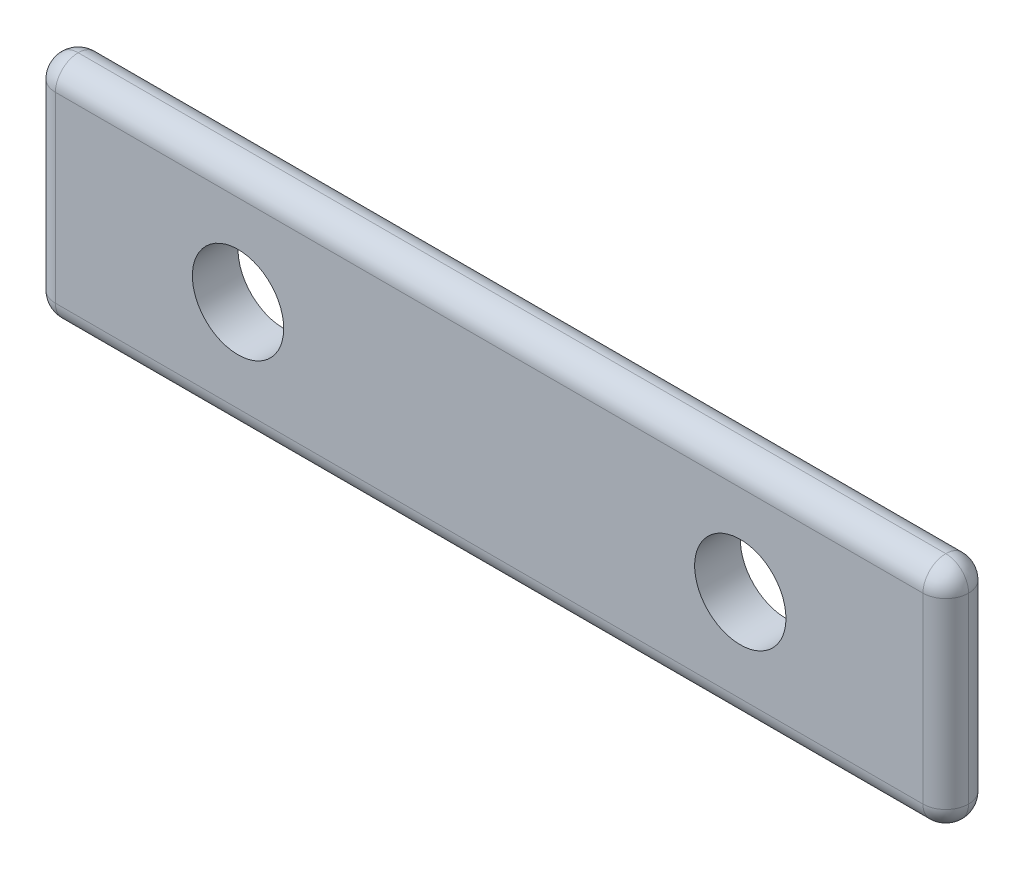
ISO-10303-21;
HEADER;
FILE_DESCRIPTION(('STEP AP214'),'2;1');
FILE_NAME('part.step','',(''),(''),'','','');
FILE_SCHEMA(('AUTOMOTIVE_DESIGN { 1 0 10303 214 1 1 1 1 }'));
ENDSEC;
DATA;
#1=APPLICATION_CONTEXT('core data for automotive mechanical design processes');
#2=APPLICATION_PROTOCOL_DEFINITION('international standard','automotive_design',2000,#1);
#3=PRODUCT_CONTEXT('',#1,'mechanical');
#4=PRODUCT('Part','Part','',(#3));
#5=PRODUCT_RELATED_PRODUCT_CATEGORY('part','',(#4));
#6=PRODUCT_DEFINITION_FORMATION('','',#4);
#7=PRODUCT_DEFINITION_CONTEXT('part definition',#1,'design');
#8=PRODUCT_DEFINITION('design','',#6,#7);
#9=PRODUCT_DEFINITION_SHAPE('','',#8);
#10=(LENGTH_UNIT() NAMED_UNIT(*) SI_UNIT(.MILLI.,.METRE.));
#11=(NAMED_UNIT(*) PLANE_ANGLE_UNIT() SI_UNIT($,.RADIAN.));
#12=(NAMED_UNIT(*) SI_UNIT($,.STERADIAN.) SOLID_ANGLE_UNIT());
#13=UNCERTAINTY_MEASURE_WITH_UNIT(LENGTH_MEASURE(1.E-05),#10,'distance_accuracy_value','');
#14=(GEOMETRIC_REPRESENTATION_CONTEXT(3) GLOBAL_UNCERTAINTY_ASSIGNED_CONTEXT((#13)) GLOBAL_UNIT_ASSIGNED_CONTEXT((#10,
#11,#12)) REPRESENTATION_CONTEXT('',''));
#15=CARTESIAN_POINT('',(0.,0.,0.));
#16=DIRECTION('',(0.,0.,1.));
#17=DIRECTION('',(1.,0.,0.));
#18=AXIS2_PLACEMENT_3D('',#15,#16,#17);
#19=CARTESIAN_POINT('',(0.,0.,10.));
#20=DIRECTION('',(0.,0.,-1.));
#21=DIRECTION('',(-1.,0.,0.));
#22=AXIS2_PLACEMENT_3D('',#19,#20,#21);
#23=PLANE('',#22);
#24=CARTESIAN_POINT('',(45.,25.2068655717166,10.));
#25=DIRECTION('',(0.,0.,1.));
#26=DIRECTION('',(1.,0.,0.));
#27=AXIS2_PLACEMENT_3D('',#24,#25,#26);
#28=CIRCLE('',#27,10.);
#29=CARTESIAN_POINT('',(55.,25.2068655717166,10.));
#30=VERTEX_POINT('',#29);
#31=EDGE_CURVE('E434',#30,#30,#28,.T.);
#32=ORIENTED_EDGE('',*,*,#31,.F.);
#33=EDGE_LOOP('',(#32));
#34=FACE_BOUND('',#33,.T.);
#35=CARTESIAN_POINT('',(155.,25.2068655717166,10.));
#36=DIRECTION('',(0.,0.,1.));
#37=DIRECTION('',(1.,0.,0.));
#38=AXIS2_PLACEMENT_3D('',#35,#36,#37);
#39=CIRCLE('',#38,10.);
#40=CARTESIAN_POINT('',(165.,25.2068655717166,10.));
#41=VERTEX_POINT('',#40);
#42=EDGE_CURVE('E438',#41,#41,#39,.T.);
#43=ORIENTED_EDGE('',*,*,#42,.F.);
#44=EDGE_LOOP('',(#43));
#45=FACE_BOUND('',#44,.T.);
#46=DIRECTION('',(0.,-1.,0.));
#47=VECTOR('',#46,1.);
#48=CARTESIAN_POINT('',(5.,0.,10.));
#49=LINE('',#48,#47);
#50=CARTESIAN_POINT('',(5.,45.,10.));
#51=VERTEX_POINT('',#50);
#52=CARTESIAN_POINT('',(5.,5.,10.));
#53=VERTEX_POINT('',#52);
#54=EDGE_CURVE('E116',#51,#53,#49,.T.);
#55=ORIENTED_EDGE('',*,*,#54,.T.);
#56=DIRECTION('',(1.,0.,0.));
#57=VECTOR('',#56,1.);
#58=CARTESIAN_POINT('',(0.,5.,10.));
#59=LINE('',#58,#57);
#60=CARTESIAN_POINT('',(195.,5.,10.));
#61=VERTEX_POINT('',#60);
#62=EDGE_CURVE('E11',#53,#61,#59,.T.);
#63=ORIENTED_EDGE('',*,*,#62,.T.);
#64=DIRECTION('',(0.,1.,0.));
#65=VECTOR('',#64,1.);
#66=CARTESIAN_POINT('',(195.,0.,10.));
#67=LINE('',#66,#65);
#68=CARTESIAN_POINT('',(195.,45.,10.));
#69=VERTEX_POINT('',#68);
#70=EDGE_CURVE('E50',#61,#69,#67,.T.);
#71=ORIENTED_EDGE('',*,*,#70,.T.);
#72=DIRECTION('',(-1.,0.,0.));
#73=VECTOR('',#72,1.);
#74=CARTESIAN_POINT('',(0.,45.,10.));
#75=LINE('',#74,#73);
#76=EDGE_CURVE('E115',#69,#51,#75,.T.);
#77=ORIENTED_EDGE('',*,*,#76,.T.);
#78=EDGE_LOOP('',(#55,#63,#71,#77));
#79=FACE_BOUND('',#78,.T.);
#80=ADVANCED_FACE('F39',(#34,#45,#79),#23,.F.);
#81=CARTESIAN_POINT('',(0.,0.,0.));
#82=DIRECTION('',(0.,0.,-1.));
#83=DIRECTION('',(-1.,0.,0.));
#84=AXIS2_PLACEMENT_3D('',#81,#82,#83);
#85=PLANE('',#84);
#86=CARTESIAN_POINT('',(45.,25.2068655717166,0.));
#87=DIRECTION('',(0.,0.,1.));
#88=DIRECTION('',(1.,0.,0.));
#89=AXIS2_PLACEMENT_3D('',#86,#87,#88);
#90=CIRCLE('',#89,9.99999999999999);
#91=CARTESIAN_POINT('',(55.,25.2068655717166,0.));
#92=VERTEX_POINT('',#91);
#93=EDGE_CURVE('E432',#92,#92,#90,.T.);
#94=ORIENTED_EDGE('',*,*,#93,.T.);
#95=EDGE_LOOP('',(#94));
#96=FACE_BOUND('',#95,.T.);
#97=CARTESIAN_POINT('',(155.,25.2068655717166,0.));
#98=DIRECTION('',(0.,0.,1.));
#99=DIRECTION('',(1.,0.,0.));
#100=AXIS2_PLACEMENT_3D('',#97,#98,#99);
#101=CIRCLE('',#100,10.);
#102=CARTESIAN_POINT('',(165.,25.2068655717166,0.));
#103=VERTEX_POINT('',#102);
#104=EDGE_CURVE('E181',#103,#103,#101,.T.);
#105=ORIENTED_EDGE('',*,*,#104,.T.);
#106=EDGE_LOOP('',(#105));
#107=FACE_BOUND('',#106,.T.);
#108=DIRECTION('',(0.,1.,0.));
#109=VECTOR('',#108,1.);
#110=CARTESIAN_POINT('',(195.,0.,0.));
#111=LINE('',#110,#109);
#112=CARTESIAN_POINT('',(195.,45.,0.));
#113=VERTEX_POINT('',#112);
#114=CARTESIAN_POINT('',(195.,5.,0.));
#115=VERTEX_POINT('',#114);
#116=EDGE_CURVE('E178',#113,#115,#111,.F.);
#117=ORIENTED_EDGE('',*,*,#116,.T.);
#118=DIRECTION('',(1.,0.,0.));
#119=VECTOR('',#118,1.);
#120=CARTESIAN_POINT('',(0.,5.,0.));
#121=LINE('',#120,#119);
#122=CARTESIAN_POINT('',(5.,5.,0.));
#123=VERTEX_POINT('',#122);
#124=EDGE_CURVE('E122',#115,#123,#121,.F.);
#125=ORIENTED_EDGE('',*,*,#124,.T.);
#126=DIRECTION('',(0.,-1.,0.));
#127=VECTOR('',#126,1.);
#128=CARTESIAN_POINT('',(5.,50.,0.));
#129=LINE('',#128,#127);
#130=CARTESIAN_POINT('',(5.,45.,0.));
#131=VERTEX_POINT('',#130);
#132=EDGE_CURVE('E102',#123,#131,#129,.F.);
#133=ORIENTED_EDGE('',*,*,#132,.T.);
#134=DIRECTION('',(-1.,0.,0.));
#135=VECTOR('',#134,1.);
#136=CARTESIAN_POINT('',(200.,45.,0.));
#137=LINE('',#136,#135);
#138=EDGE_CURVE('E172',#131,#113,#137,.F.);
#139=ORIENTED_EDGE('',*,*,#138,.T.);
#140=EDGE_LOOP('',(#117,#125,#133,#139));
#141=FACE_BOUND('',#140,.T.);
#142=ADVANCED_FACE('F257',(#96,#107,#141),#85,.T.);
#143=CARTESIAN_POINT('',(5.,0.,5.));
#144=DIRECTION('',(0.,-1.,0.));
#145=DIRECTION('',(0.,0.,-1.));
#146=AXIS2_PLACEMENT_3D('',#143,#144,#145);
#147=CYLINDRICAL_SURFACE('',#146,5.);
#148=DIRECTION('',(0.,-1.,0.));
#149=VECTOR('',#148,1.);
#150=CARTESIAN_POINT('',(0.,0.,5.));
#151=LINE('',#150,#149);
#152=CARTESIAN_POINT('',(0.,5.,5.));
#153=VERTEX_POINT('',#152);
#154=CARTESIAN_POINT('',(0.,45.,5.));
#155=VERTEX_POINT('',#154);
#156=EDGE_CURVE('E158',#153,#155,#151,.F.);
#157=ORIENTED_EDGE('',*,*,#156,.F.);
#158=CARTESIAN_POINT('',(5.,5.,5.));
#159=DIRECTION('',(0.,-1.,0.));
#160=DIRECTION('',(0.,0.,-1.));
#161=AXIS2_PLACEMENT_3D('',#158,#159,#160);
#162=CIRCLE('',#161,5.);
#163=EDGE_CURVE('E43',#53,#153,#162,.T.);
#164=ORIENTED_EDGE('',*,*,#163,.F.);
#165=ORIENTED_EDGE('',*,*,#54,.F.);
#166=CARTESIAN_POINT('',(5.,45.,5.));
#167=DIRECTION('',(0.,1.,0.));
#168=DIRECTION('',(0.,0.,1.));
#169=AXIS2_PLACEMENT_3D('',#166,#167,#168);
#170=CIRCLE('',#169,5.);
#171=EDGE_CURVE('E86',#155,#51,#170,.T.);
#172=ORIENTED_EDGE('',*,*,#171,.F.);
#173=EDGE_LOOP('',(#157,#164,#165,#172));
#174=FACE_BOUND('',#173,.T.);
#175=ADVANCED_FACE('F41',(#174),#147,.T.);
#176=CARTESIAN_POINT('',(5.,5.,5.));
#177=DIRECTION('',(-1.,0.,0.));
#178=DIRECTION('',(0.,0.,1.));
#179=AXIS2_PLACEMENT_3D('',#176,#177,#178);
#180=SPHERICAL_SURFACE('',#179,5.);
#181=ORIENTED_EDGE('',*,*,#163,.T.);
#182=CARTESIAN_POINT('',(5.,5.,5.));
#183=DIRECTION('',(0.,0.,-1.));
#184=DIRECTION('',(-1.,0.,0.));
#185=AXIS2_PLACEMENT_3D('',#182,#183,#184);
#186=CIRCLE('',#185,5.);
#187=CARTESIAN_POINT('',(5.,0.,5.));
#188=VERTEX_POINT('',#187);
#189=EDGE_CURVE('E93',#188,#153,#186,.T.);
#190=ORIENTED_EDGE('',*,*,#189,.F.);
#191=CARTESIAN_POINT('',(5.,5.,5.));
#192=DIRECTION('',(-1.,0.,0.));
#193=DIRECTION('',(0.,0.,1.));
#194=AXIS2_PLACEMENT_3D('',#191,#192,#193);
#195=CIRCLE('',#194,5.);
#196=EDGE_CURVE('E141',#53,#188,#195,.F.);
#197=ORIENTED_EDGE('',*,*,#196,.F.);
#198=EDGE_LOOP('',(#181,#190,#197));
#199=FACE_BOUND('',#198,.T.);
#200=ADVANCED_FACE('F170',(#199),#180,.T.);
#201=CARTESIAN_POINT('',(5.,45.,5.));
#202=DIRECTION('',(-1.,0.,0.));
#203=DIRECTION('',(0.,0.,1.));
#204=AXIS2_PLACEMENT_3D('',#201,#202,#203);
#205=SPHERICAL_SURFACE('',#204,5.);
#206=CARTESIAN_POINT('',(5.,45.,5.));
#207=DIRECTION('',(0.,0.,1.));
#208=DIRECTION('',(1.,0.,0.));
#209=AXIS2_PLACEMENT_3D('',#206,#207,#208);
#210=CIRCLE('',#209,5.);
#211=CARTESIAN_POINT('',(5.,50.,5.));
#212=VERTEX_POINT('',#211);
#213=EDGE_CURVE('E132',#155,#212,#210,.F.);
#214=ORIENTED_EDGE('',*,*,#213,.F.);
#215=ORIENTED_EDGE('',*,*,#171,.T.);
#216=CARTESIAN_POINT('',(5.,45.,5.));
#217=DIRECTION('',(-1.,0.,0.));
#218=DIRECTION('',(0.,0.,1.));
#219=AXIS2_PLACEMENT_3D('',#216,#217,#218);
#220=CIRCLE('',#219,5.);
#221=EDGE_CURVE('E130',#212,#51,#220,.F.);
#222=ORIENTED_EDGE('',*,*,#221,.F.);
#223=EDGE_LOOP('',(#214,#215,#222));
#224=FACE_BOUND('',#223,.T.);
#225=ADVANCED_FACE('F129',(#224),#205,.T.);
#226=CARTESIAN_POINT('',(5.,0.,5.));
#227=DIRECTION('',(0.,1.,0.));
#228=DIRECTION('',(0.,0.,1.));
#229=AXIS2_PLACEMENT_3D('',#226,#227,#228);
#230=CYLINDRICAL_SURFACE('',#229,5.);
#231=CARTESIAN_POINT('',(5.,5.,5.));
#232=DIRECTION('',(0.,-1.,0.));
#233=DIRECTION('',(0.,0.,-1.));
#234=AXIS2_PLACEMENT_3D('',#231,#232,#233);
#235=CIRCLE('',#234,5.);
#236=EDGE_CURVE('E155',#153,#123,#235,.T.);
#237=ORIENTED_EDGE('',*,*,#236,.F.);
#238=ORIENTED_EDGE('',*,*,#156,.T.);
#239=CARTESIAN_POINT('',(5.,45.,5.));
#240=DIRECTION('',(0.,1.,0.));
#241=DIRECTION('',(0.,0.,1.));
#242=AXIS2_PLACEMENT_3D('',#239,#240,#241);
#243=CIRCLE('',#242,5.);
#244=EDGE_CURVE('E142',#131,#155,#243,.T.);
#245=ORIENTED_EDGE('',*,*,#244,.F.);
#246=ORIENTED_EDGE('',*,*,#132,.F.);
#247=EDGE_LOOP('',(#237,#238,#245,#246));
#248=FACE_BOUND('',#247,.T.);
#249=ADVANCED_FACE('F168',(#248),#230,.T.);
#250=CARTESIAN_POINT('',(5.,5.,5.));
#251=DIRECTION('',(-1.,0.,0.));
#252=DIRECTION('',(0.,0.,1.));
#253=AXIS2_PLACEMENT_3D('',#250,#251,#252);
#254=SPHERICAL_SURFACE('',#253,5.);
#255=ORIENTED_EDGE('',*,*,#189,.T.);
#256=ORIENTED_EDGE('',*,*,#236,.T.);
#257=CARTESIAN_POINT('',(5.,5.,5.));
#258=DIRECTION('',(-1.,0.,0.));
#259=DIRECTION('',(0.,-1.,0.));
#260=AXIS2_PLACEMENT_3D('',#257,#258,#259);
#261=CIRCLE('',#260,5.);
#262=EDGE_CURVE('E149',#188,#123,#261,.F.);
#263=ORIENTED_EDGE('',*,*,#262,.F.);
#264=EDGE_LOOP('',(#255,#256,#263));
#265=FACE_BOUND('',#264,.T.);
#266=ADVANCED_FACE('F245',(#265),#254,.T.);
#267=CARTESIAN_POINT('',(0.,5.,5.));
#268=DIRECTION('',(1.,0.,0.));
#269=DIRECTION('',(0.,0.,-1.));
#270=AXIS2_PLACEMENT_3D('',#267,#268,#269);
#271=CYLINDRICAL_SURFACE('',#270,5.);
#272=ORIENTED_EDGE('',*,*,#62,.F.);
#273=ORIENTED_EDGE('',*,*,#196,.T.);
#274=DIRECTION('',(1.,0.,0.));
#275=VECTOR('',#274,1.);
#276=CARTESIAN_POINT('',(200.,0.,5.));
#277=LINE('',#276,#275);
#278=CARTESIAN_POINT('',(195.,0.,5.));
#279=VERTEX_POINT('',#278);
#280=EDGE_CURVE('E236',#279,#188,#277,.F.);
#281=ORIENTED_EDGE('',*,*,#280,.F.);
#282=CARTESIAN_POINT('',(195.,5.,5.));
#283=DIRECTION('',(1.,0.,0.));
#284=DIRECTION('',(0.,0.,-1.));
#285=AXIS2_PLACEMENT_3D('',#282,#283,#284);
#286=CIRCLE('',#285,5.);
#287=EDGE_CURVE('E232',#61,#279,#286,.T.);
#288=ORIENTED_EDGE('',*,*,#287,.F.);
#289=EDGE_LOOP('',(#272,#273,#281,#288));
#290=FACE_BOUND('',#289,.T.);
#291=ADVANCED_FACE('F247',(#290),#271,.T.);
#292=CARTESIAN_POINT('',(0.,45.,5.));
#293=DIRECTION('',(-1.,0.,0.));
#294=DIRECTION('',(0.,0.,1.));
#295=AXIS2_PLACEMENT_3D('',#292,#293,#294);
#296=CYLINDRICAL_SURFACE('',#295,5.);
#297=ORIENTED_EDGE('',*,*,#221,.T.);
#298=ORIENTED_EDGE('',*,*,#76,.F.);
#299=CARTESIAN_POINT('',(195.,45.,5.));
#300=DIRECTION('',(1.,0.,0.));
#301=DIRECTION('',(0.,0.,-1.));
#302=AXIS2_PLACEMENT_3D('',#299,#300,#301);
#303=CIRCLE('',#302,5.);
#304=CARTESIAN_POINT('',(195.,50.,5.));
#305=VERTEX_POINT('',#304);
#306=EDGE_CURVE('E228',#305,#69,#303,.T.);
#307=ORIENTED_EDGE('',*,*,#306,.F.);
#308=DIRECTION('',(-1.,0.,0.));
#309=VECTOR('',#308,1.);
#310=CARTESIAN_POINT('',(0.,50.,5.));
#311=LINE('',#310,#309);
#312=EDGE_CURVE('E138',#212,#305,#311,.F.);
#313=ORIENTED_EDGE('',*,*,#312,.F.);
#314=EDGE_LOOP('',(#297,#298,#307,#313));
#315=FACE_BOUND('',#314,.T.);
#316=ADVANCED_FACE('F136',(#315),#296,.T.);
#317=CARTESIAN_POINT('',(5.,45.,5.));
#318=DIRECTION('',(-1.,0.,0.));
#319=DIRECTION('',(0.,0.,1.));
#320=AXIS2_PLACEMENT_3D('',#317,#318,#319);
#321=SPHERICAL_SURFACE('',#320,5.);
#322=ORIENTED_EDGE('',*,*,#244,.T.);
#323=ORIENTED_EDGE('',*,*,#213,.T.);
#324=CARTESIAN_POINT('',(5.,45.,5.));
#325=DIRECTION('',(-1.,0.,0.));
#326=DIRECTION('',(0.,0.,1.));
#327=AXIS2_PLACEMENT_3D('',#324,#325,#326);
#328=CIRCLE('',#327,5.);
#329=EDGE_CURVE('E165',#131,#212,#328,.F.);
#330=ORIENTED_EDGE('',*,*,#329,.F.);
#331=EDGE_LOOP('',(#322,#323,#330));
#332=FACE_BOUND('',#331,.T.);
#333=ADVANCED_FACE('F164',(#332),#321,.T.);
#334=CARTESIAN_POINT('',(200.,5.,5.));
#335=DIRECTION('',(-1.,0.,0.));
#336=DIRECTION('',(0.,0.,1.));
#337=AXIS2_PLACEMENT_3D('',#334,#335,#336);
#338=CYLINDRICAL_SURFACE('',#337,5.);
#339=CARTESIAN_POINT('',(195.,5.,5.));
#340=DIRECTION('',(1.,0.,0.));
#341=DIRECTION('',(0.,0.,-1.));
#342=AXIS2_PLACEMENT_3D('',#339,#340,#341);
#343=CIRCLE('',#342,5.);
#344=EDGE_CURVE('E216',#279,#115,#343,.T.);
#345=ORIENTED_EDGE('',*,*,#344,.F.);
#346=ORIENTED_EDGE('',*,*,#280,.T.);
#347=ORIENTED_EDGE('',*,*,#262,.T.);
#348=ORIENTED_EDGE('',*,*,#124,.F.);
#349=EDGE_LOOP('',(#345,#346,#347,#348));
#350=FACE_BOUND('',#349,.T.);
#351=ADVANCED_FACE('F244',(#350),#338,.T.);
#352=CARTESIAN_POINT('',(195.,5.,5.));
#353=DIRECTION('',(0.,-1.,0.));
#354=DIRECTION('',(0.,0.,-1.));
#355=AXIS2_PLACEMENT_3D('',#352,#353,#354);
#356=SPHERICAL_SURFACE('',#355,5.);
#357=ORIENTED_EDGE('',*,*,#287,.T.);
#358=CARTESIAN_POINT('',(195.,5.,5.));
#359=DIRECTION('',(0.,0.,-1.));
#360=DIRECTION('',(-1.,0.,0.));
#361=AXIS2_PLACEMENT_3D('',#358,#359,#360);
#362=CIRCLE('',#361,5.);
#363=CARTESIAN_POINT('',(200.,5.,5.));
#364=VERTEX_POINT('',#363);
#365=EDGE_CURVE('E212',#364,#279,#362,.T.);
#366=ORIENTED_EDGE('',*,*,#365,.F.);
#367=CARTESIAN_POINT('',(195.,5.,5.));
#368=DIRECTION('',(0.,-1.,0.));
#369=DIRECTION('',(0.,0.,-1.));
#370=AXIS2_PLACEMENT_3D('',#367,#368,#369);
#371=CIRCLE('',#370,5.);
#372=EDGE_CURVE('E208',#61,#364,#371,.F.);
#373=ORIENTED_EDGE('',*,*,#372,.F.);
#374=EDGE_LOOP('',(#357,#366,#373));
#375=FACE_BOUND('',#374,.T.);
#376=ADVANCED_FACE('F294',(#375),#356,.T.);
#377=CARTESIAN_POINT('',(195.,45.,5.));
#378=DIRECTION('',(0.,1.,0.));
#379=DIRECTION('',(0.,0.,1.));
#380=AXIS2_PLACEMENT_3D('',#377,#378,#379);
#381=SPHERICAL_SURFACE('',#380,5.);
#382=CARTESIAN_POINT('',(195.,45.,5.));
#383=DIRECTION('',(0.,0.,1.));
#384=DIRECTION('',(1.,0.,0.));
#385=AXIS2_PLACEMENT_3D('',#382,#383,#384);
#386=CIRCLE('',#385,5.);
#387=CARTESIAN_POINT('',(200.,45.,5.));
#388=VERTEX_POINT('',#387);
#389=EDGE_CURVE('E224',#305,#388,#386,.F.);
#390=ORIENTED_EDGE('',*,*,#389,.F.);
#391=ORIENTED_EDGE('',*,*,#306,.T.);
#392=CARTESIAN_POINT('',(195.,45.,5.));
#393=DIRECTION('',(0.,1.,0.));
#394=DIRECTION('',(0.,0.,1.));
#395=AXIS2_PLACEMENT_3D('',#392,#393,#394);
#396=CIRCLE('',#395,5.);
#397=EDGE_CURVE('E205',#388,#69,#396,.F.);
#398=ORIENTED_EDGE('',*,*,#397,.F.);
#399=EDGE_LOOP('',(#390,#391,#398));
#400=FACE_BOUND('',#399,.T.);
#401=ADVANCED_FACE('F290',(#400),#381,.T.);
#402=CARTESIAN_POINT('',(0.,45.,5.));
#403=DIRECTION('',(1.,0.,0.));
#404=DIRECTION('',(0.,0.,-1.));
#405=AXIS2_PLACEMENT_3D('',#402,#403,#404);
#406=CYLINDRICAL_SURFACE('',#405,5.);
#407=ORIENTED_EDGE('',*,*,#329,.T.);
#408=ORIENTED_EDGE('',*,*,#312,.T.);
#409=CARTESIAN_POINT('',(195.,45.,5.));
#410=DIRECTION('',(1.,0.,0.));
#411=DIRECTION('',(0.,0.,-1.));
#412=AXIS2_PLACEMENT_3D('',#409,#410,#411);
#413=CIRCLE('',#412,5.);
#414=EDGE_CURVE('E201',#113,#305,#413,.T.);
#415=ORIENTED_EDGE('',*,*,#414,.F.);
#416=ORIENTED_EDGE('',*,*,#138,.F.);
#417=EDGE_LOOP('',(#407,#408,#415,#416));
#418=FACE_BOUND('',#417,.T.);
#419=ADVANCED_FACE('F286',(#418),#406,.T.);
#420=CARTESIAN_POINT('',(195.,5.,5.));
#421=DIRECTION('',(0.,-1.,0.));
#422=DIRECTION('',(0.,0.,-1.));
#423=AXIS2_PLACEMENT_3D('',#420,#421,#422);
#424=SPHERICAL_SURFACE('',#423,5.);
#425=ORIENTED_EDGE('',*,*,#365,.T.);
#426=ORIENTED_EDGE('',*,*,#344,.T.);
#427=CARTESIAN_POINT('',(195.,5.,5.));
#428=DIRECTION('',(0.,-1.,0.));
#429=DIRECTION('',(1.,0.,0.));
#430=AXIS2_PLACEMENT_3D('',#427,#428,#429);
#431=CIRCLE('',#430,5.);
#432=EDGE_CURVE('E198',#364,#115,#431,.F.);
#433=ORIENTED_EDGE('',*,*,#432,.F.);
#434=EDGE_LOOP('',(#425,#426,#433));
#435=FACE_BOUND('',#434,.T.);
#436=ADVANCED_FACE('F282',(#435),#424,.T.);
#437=CARTESIAN_POINT('',(195.,0.,5.));
#438=DIRECTION('',(0.,1.,0.));
#439=DIRECTION('',(0.,0.,1.));
#440=AXIS2_PLACEMENT_3D('',#437,#438,#439);
#441=CYLINDRICAL_SURFACE('',#440,5.);
#442=ORIENTED_EDGE('',*,*,#70,.F.);
#443=ORIENTED_EDGE('',*,*,#372,.T.);
#444=DIRECTION('',(0.,1.,0.));
#445=VECTOR('',#444,1.);
#446=CARTESIAN_POINT('',(200.,50.,5.));
#447=LINE('',#446,#445);
#448=EDGE_CURVE('E194',#388,#364,#447,.F.);
#449=ORIENTED_EDGE('',*,*,#448,.F.);
#450=ORIENTED_EDGE('',*,*,#397,.T.);
#451=EDGE_LOOP('',(#442,#443,#449,#450));
#452=FACE_BOUND('',#451,.T.);
#453=ADVANCED_FACE('F278',(#452),#441,.T.);
#454=CARTESIAN_POINT('',(195.,45.,5.));
#455=DIRECTION('',(0.,1.,0.));
#456=DIRECTION('',(0.,0.,1.));
#457=AXIS2_PLACEMENT_3D('',#454,#455,#456);
#458=SPHERICAL_SURFACE('',#457,5.);
#459=ORIENTED_EDGE('',*,*,#414,.T.);
#460=ORIENTED_EDGE('',*,*,#389,.T.);
#461=CARTESIAN_POINT('',(195.,45.,5.));
#462=DIRECTION('',(0.,1.,0.));
#463=DIRECTION('',(0.,0.,1.));
#464=AXIS2_PLACEMENT_3D('',#461,#462,#463);
#465=CIRCLE('',#464,5.);
#466=EDGE_CURVE('E190',#113,#388,#465,.F.);
#467=ORIENTED_EDGE('',*,*,#466,.F.);
#468=EDGE_LOOP('',(#459,#460,#467));
#469=FACE_BOUND('',#468,.T.);
#470=ADVANCED_FACE('F274',(#469),#458,.T.);
#471=CARTESIAN_POINT('',(195.,50.,5.));
#472=DIRECTION('',(0.,-1.,0.));
#473=DIRECTION('',(0.,0.,-1.));
#474=AXIS2_PLACEMENT_3D('',#471,#472,#473);
#475=CYLINDRICAL_SURFACE('',#474,5.);
#476=ORIENTED_EDGE('',*,*,#432,.T.);
#477=ORIENTED_EDGE('',*,*,#116,.F.);
#478=ORIENTED_EDGE('',*,*,#466,.T.);
#479=ORIENTED_EDGE('',*,*,#448,.T.);
#480=EDGE_LOOP('',(#476,#477,#478,#479));
#481=FACE_BOUND('',#480,.T.);
#482=ADVANCED_FACE('F271',(#481),#475,.T.);
#483=CARTESIAN_POINT('',(155.,25.2068655717166,10.));
#484=DIRECTION('',(0.,0.,1.));
#485=DIRECTION('',(1.,0.,0.));
#486=AXIS2_PLACEMENT_3D('',#483,#484,#485);
#487=CYLINDRICAL_SURFACE('',#486,10.);
#488=ORIENTED_EDGE('',*,*,#104,.F.);
#489=EDGE_LOOP('',(#488));
#490=FACE_BOUND('',#489,.T.);
#491=ORIENTED_EDGE('',*,*,#42,.T.);
#492=EDGE_LOOP('',(#491));
#493=FACE_BOUND('',#492,.T.);
#494=ADVANCED_FACE('F268',(#490,#493),#487,.F.);
#495=CARTESIAN_POINT('',(45.,25.2068655717166,10.));
#496=DIRECTION('',(0.,0.,1.));
#497=DIRECTION('',(1.,0.,0.));
#498=AXIS2_PLACEMENT_3D('',#495,#496,#497);
#499=CYLINDRICAL_SURFACE('',#498,10.);
#500=ORIENTED_EDGE('',*,*,#93,.F.);
#501=EDGE_LOOP('',(#500));
#502=FACE_BOUND('',#501,.T.);
#503=ORIENTED_EDGE('',*,*,#31,.T.);
#504=EDGE_LOOP('',(#503));
#505=FACE_BOUND('',#504,.T.);
#506=ADVANCED_FACE('F350',(#502,#505),#499,.F.);
#507=CLOSED_SHELL('',(#80,#142,#175,#200,#225,#249,#266,#291,#316,#333,#351,#376,#401,#419,#436,
#453,#470,#482,#494,#506));
#508=MANIFOLD_SOLID_BREP('B2',#507);
#509=ADVANCED_BREP_SHAPE_REPRESENTATION('',(#18,#508),#14);
#510=SHAPE_DEFINITION_REPRESENTATION(#9,#509);
ENDSEC;
END-ISO-10303-21;
